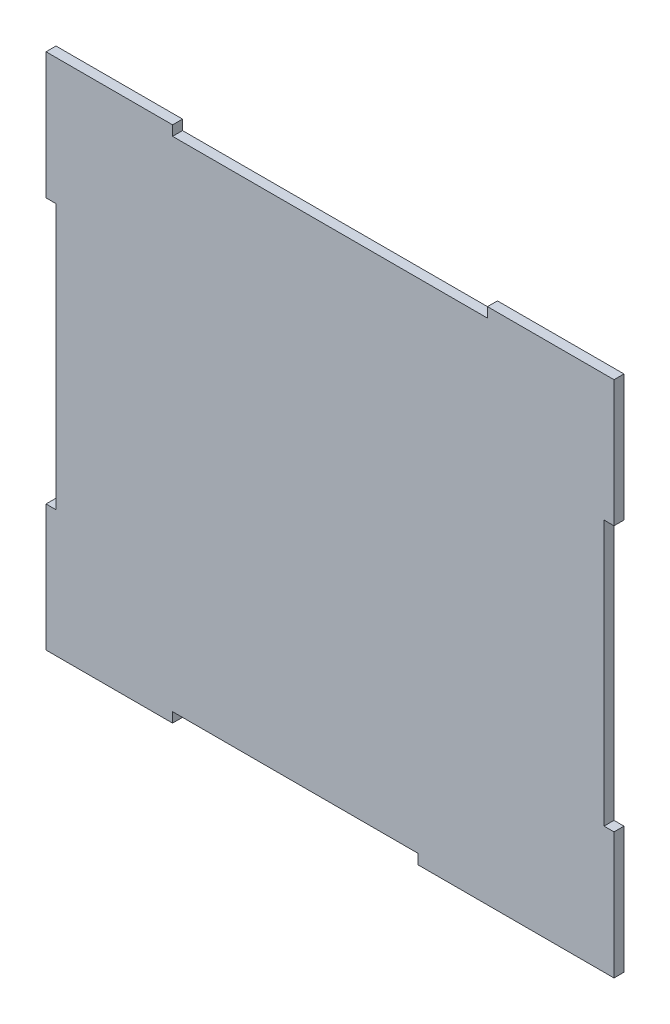
ISO-10303-21;
HEADER;
FILE_DESCRIPTION(('STEP AP214'),'2;1');
FILE_NAME('part.step','',(''),(''),'','','');
FILE_SCHEMA(('AUTOMOTIVE_DESIGN { 1 0 10303 214 1 1 1 1 }'));
ENDSEC;
DATA;
#1=APPLICATION_CONTEXT('core data for automotive mechanical design processes');
#2=APPLICATION_PROTOCOL_DEFINITION('international standard','automotive_design',2000,#1);
#3=PRODUCT_CONTEXT('',#1,'mechanical');
#4=PRODUCT('Part','Part','',(#3));
#5=PRODUCT_RELATED_PRODUCT_CATEGORY('part','',(#4));
#6=PRODUCT_DEFINITION_FORMATION('','',#4);
#7=PRODUCT_DEFINITION_CONTEXT('part definition',#1,'design');
#8=PRODUCT_DEFINITION('design','',#6,#7);
#9=PRODUCT_DEFINITION_SHAPE('','',#8);
#10=(LENGTH_UNIT() NAMED_UNIT(*) SI_UNIT(.MILLI.,.METRE.));
#11=(NAMED_UNIT(*) PLANE_ANGLE_UNIT() SI_UNIT($,.RADIAN.));
#12=(NAMED_UNIT(*) SI_UNIT($,.STERADIAN.) SOLID_ANGLE_UNIT());
#13=UNCERTAINTY_MEASURE_WITH_UNIT(LENGTH_MEASURE(1.E-05),#10,'distance_accuracy_value','');
#14=(GEOMETRIC_REPRESENTATION_CONTEXT(3) GLOBAL_UNCERTAINTY_ASSIGNED_CONTEXT((#13)) GLOBAL_UNIT_ASSIGNED_CONTEXT((#10,
#11,#12)) REPRESENTATION_CONTEXT('',''));
#15=CARTESIAN_POINT('',(0.,0.,0.));
#16=DIRECTION('',(0.,0.,1.));
#17=DIRECTION('',(1.,0.,0.));
#18=AXIS2_PLACEMENT_3D('',#15,#16,#17);
#19=CARTESIAN_POINT('',(-52.,26.6,2.));
#20=DIRECTION('',(1.,0.,0.));
#21=DIRECTION('',(0.,0.,-1.));
#22=AXIS2_PLACEMENT_3D('',#19,#20,#21);
#23=PLANE('',#22);
#24=DIRECTION('',(0.,-1.,0.));
#25=VECTOR('',#24,1.);
#26=CARTESIAN_POINT('',(-52.,26.6,0.));
#27=LINE('',#26,#25);
#28=CARTESIAN_POINT('',(-52.,52.,0.));
#29=VERTEX_POINT('',#28);
#30=CARTESIAN_POINT('',(-52.,26.6,0.));
#31=VERTEX_POINT('',#30);
#32=EDGE_CURVE('E205',#29,#31,#27,.T.);
#33=ORIENTED_EDGE('',*,*,#32,.T.);
#34=DIRECTION('',(0.,0.,-1.));
#35=VECTOR('',#34,1.);
#36=CARTESIAN_POINT('',(-52.,26.6,2.));
#37=LINE('',#36,#35);
#38=CARTESIAN_POINT('',(-52.,26.6,2.));
#39=VERTEX_POINT('',#38);
#40=EDGE_CURVE('E11',#39,#31,#37,.T.);
#41=ORIENTED_EDGE('',*,*,#40,.F.);
#42=DIRECTION('',(0.,-1.,0.));
#43=VECTOR('',#42,1.);
#44=CARTESIAN_POINT('',(-52.,26.6,2.));
#45=LINE('',#44,#43);
#46=CARTESIAN_POINT('',(-52.,52.,2.));
#47=VERTEX_POINT('',#46);
#48=EDGE_CURVE('E243',#47,#39,#45,.T.);
#49=ORIENTED_EDGE('',*,*,#48,.F.);
#50=DIRECTION('',(0.,0.,-1.));
#51=VECTOR('',#50,1.);
#52=CARTESIAN_POINT('',(-52.,52.,2.));
#53=LINE('',#52,#51);
#54=EDGE_CURVE('E201',#47,#29,#53,.T.);
#55=ORIENTED_EDGE('',*,*,#54,.T.);
#56=EDGE_LOOP('',(#33,#41,#49,#55));
#57=FACE_BOUND('',#56,.T.);
#58=ADVANCED_FACE('F37',(#57),#23,.F.);
#59=CARTESIAN_POINT('',(-52.,26.6,2.));
#60=DIRECTION('',(0.,1.,0.));
#61=DIRECTION('',(0.,0.,1.));
#62=AXIS2_PLACEMENT_3D('',#59,#60,#61);
#63=PLANE('',#62);
#64=DIRECTION('',(1.,0.,0.));
#65=VECTOR('',#64,1.);
#66=CARTESIAN_POINT('',(-52.,26.6,0.));
#67=LINE('',#66,#65);
#68=CARTESIAN_POINT('',(-50.,26.6,0.));
#69=VERTEX_POINT('',#68);
#70=EDGE_CURVE('E208',#31,#69,#67,.T.);
#71=ORIENTED_EDGE('',*,*,#70,.T.);
#72=DIRECTION('',(0.,0.,-1.));
#73=VECTOR('',#72,1.);
#74=CARTESIAN_POINT('',(-50.,26.6,2.));
#75=LINE('',#74,#73);
#76=CARTESIAN_POINT('',(-50.,26.6,2.));
#77=VERTEX_POINT('',#76);
#78=EDGE_CURVE('E45',#77,#69,#75,.T.);
#79=ORIENTED_EDGE('',*,*,#78,.F.);
#80=DIRECTION('',(1.,0.,0.));
#81=VECTOR('',#80,1.);
#82=CARTESIAN_POINT('',(-52.,26.6,2.));
#83=LINE('',#82,#81);
#84=EDGE_CURVE('E132',#39,#77,#83,.T.);
#85=ORIENTED_EDGE('',*,*,#84,.F.);
#86=ORIENTED_EDGE('',*,*,#40,.T.);
#87=EDGE_LOOP('',(#71,#79,#85,#86));
#88=FACE_BOUND('',#87,.T.);
#89=ADVANCED_FACE('F361',(#88),#63,.F.);
#90=CARTESIAN_POINT('',(-50.,-26.6,2.));
#91=DIRECTION('',(1.,0.,0.));
#92=DIRECTION('',(0.,0.,-1.));
#93=AXIS2_PLACEMENT_3D('',#90,#91,#92);
#94=PLANE('',#93);
#95=DIRECTION('',(0.,-1.,0.));
#96=VECTOR('',#95,1.);
#97=CARTESIAN_POINT('',(-50.,-26.6,0.));
#98=LINE('',#97,#96);
#99=CARTESIAN_POINT('',(-50.,-26.6,0.));
#100=VERTEX_POINT('',#99);
#101=EDGE_CURVE('E210',#69,#100,#98,.T.);
#102=ORIENTED_EDGE('',*,*,#101,.T.);
#103=DIRECTION('',(0.,0.,-1.));
#104=VECTOR('',#103,1.);
#105=CARTESIAN_POINT('',(-50.,-26.6,2.));
#106=LINE('',#105,#104);
#107=CARTESIAN_POINT('',(-50.,-26.6,2.));
#108=VERTEX_POINT('',#107);
#109=EDGE_CURVE('E286',#108,#100,#106,.T.);
#110=ORIENTED_EDGE('',*,*,#109,.F.);
#111=DIRECTION('',(0.,-1.,0.));
#112=VECTOR('',#111,1.);
#113=CARTESIAN_POINT('',(-50.,-26.6,2.));
#114=LINE('',#113,#112);
#115=EDGE_CURVE('E294',#77,#108,#114,.T.);
#116=ORIENTED_EDGE('',*,*,#115,.F.);
#117=ORIENTED_EDGE('',*,*,#78,.T.);
#118=EDGE_LOOP('',(#102,#110,#116,#117));
#119=FACE_BOUND('',#118,.T.);
#120=ADVANCED_FACE('F292',(#119),#94,.F.);
#121=CARTESIAN_POINT('',(-52.,-26.6,2.));
#122=DIRECTION('',(0.,-1.,0.));
#123=DIRECTION('',(0.,0.,-1.));
#124=AXIS2_PLACEMENT_3D('',#121,#122,#123);
#125=PLANE('',#124);
#126=DIRECTION('',(-1.,0.,0.));
#127=VECTOR('',#126,1.);
#128=CARTESIAN_POINT('',(-52.,-26.6,0.));
#129=LINE('',#128,#127);
#130=CARTESIAN_POINT('',(-52.,-26.6,0.));
#131=VERTEX_POINT('',#130);
#132=EDGE_CURVE('E212',#100,#131,#129,.T.);
#133=ORIENTED_EDGE('',*,*,#132,.T.);
#134=DIRECTION('',(0.,0.,-1.));
#135=VECTOR('',#134,1.);
#136=CARTESIAN_POINT('',(-52.,-26.6,2.));
#137=LINE('',#136,#135);
#138=CARTESIAN_POINT('',(-52.,-26.6,2.));
#139=VERTEX_POINT('',#138);
#140=EDGE_CURVE('E283',#139,#131,#137,.T.);
#141=ORIENTED_EDGE('',*,*,#140,.F.);
#142=DIRECTION('',(-1.,0.,0.));
#143=VECTOR('',#142,1.);
#144=CARTESIAN_POINT('',(-52.,-26.6,2.));
#145=LINE('',#144,#143);
#146=EDGE_CURVE('E312',#108,#139,#145,.T.);
#147=ORIENTED_EDGE('',*,*,#146,.F.);
#148=ORIENTED_EDGE('',*,*,#109,.T.);
#149=EDGE_LOOP('',(#133,#141,#147,#148));
#150=FACE_BOUND('',#149,.T.);
#151=ADVANCED_FACE('F303',(#150),#125,.F.);
#152=CARTESIAN_POINT('',(-52.,-52.,2.));
#153=DIRECTION('',(1.,0.,0.));
#154=DIRECTION('',(0.,0.,-1.));
#155=AXIS2_PLACEMENT_3D('',#152,#153,#154);
#156=PLANE('',#155);
#157=DIRECTION('',(0.,-1.,0.));
#158=VECTOR('',#157,1.);
#159=CARTESIAN_POINT('',(-52.,-52.,0.));
#160=LINE('',#159,#158);
#161=CARTESIAN_POINT('',(-52.,-52.,0.));
#162=VERTEX_POINT('',#161);
#163=EDGE_CURVE('E214',#131,#162,#160,.T.);
#164=ORIENTED_EDGE('',*,*,#163,.T.);
#165=DIRECTION('',(0.,0.,-1.));
#166=VECTOR('',#165,1.);
#167=CARTESIAN_POINT('',(-52.,-52.,2.));
#168=LINE('',#167,#166);
#169=CARTESIAN_POINT('',(-52.,-52.,2.));
#170=VERTEX_POINT('',#169);
#171=EDGE_CURVE('E280',#170,#162,#168,.T.);
#172=ORIENTED_EDGE('',*,*,#171,.F.);
#173=DIRECTION('',(0.,-1.,0.));
#174=VECTOR('',#173,1.);
#175=CARTESIAN_POINT('',(-52.,-52.,2.));
#176=LINE('',#175,#174);
#177=EDGE_CURVE('E309',#139,#170,#176,.T.);
#178=ORIENTED_EDGE('',*,*,#177,.F.);
#179=ORIENTED_EDGE('',*,*,#140,.T.);
#180=EDGE_LOOP('',(#164,#172,#178,#179));
#181=FACE_BOUND('',#180,.T.);
#182=ADVANCED_FACE('F307',(#181),#156,.F.);
#183=CARTESIAN_POINT('',(-52.,-52.,2.));
#184=DIRECTION('',(0.,1.,0.));
#185=DIRECTION('',(0.,0.,1.));
#186=AXIS2_PLACEMENT_3D('',#183,#184,#185);
#187=PLANE('',#186);
#188=DIRECTION('',(1.,0.,0.));
#189=VECTOR('',#188,1.);
#190=CARTESIAN_POINT('',(-52.,-52.,0.));
#191=LINE('',#190,#189);
#192=CARTESIAN_POINT('',(-26.6,-52.,0.));
#193=VERTEX_POINT('',#192);
#194=EDGE_CURVE('E216',#162,#193,#191,.T.);
#195=ORIENTED_EDGE('',*,*,#194,.T.);
#196=DIRECTION('',(0.,0.,-1.));
#197=VECTOR('',#196,1.);
#198=CARTESIAN_POINT('',(-26.6,-52.,2.));
#199=LINE('',#198,#197);
#200=CARTESIAN_POINT('',(-26.6,-52.,2.));
#201=VERTEX_POINT('',#200);
#202=EDGE_CURVE('E277',#201,#193,#199,.T.);
#203=ORIENTED_EDGE('',*,*,#202,.F.);
#204=DIRECTION('',(1.,0.,0.));
#205=VECTOR('',#204,1.);
#206=CARTESIAN_POINT('',(-52.,-52.,2.));
#207=LINE('',#206,#205);
#208=EDGE_CURVE('E311',#170,#201,#207,.T.);
#209=ORIENTED_EDGE('',*,*,#208,.F.);
#210=ORIENTED_EDGE('',*,*,#171,.T.);
#211=EDGE_LOOP('',(#195,#203,#209,#210));
#212=FACE_BOUND('',#211,.T.);
#213=ADVANCED_FACE('F374',(#212),#187,.F.);
#214=CARTESIAN_POINT('',(-26.6,-50.,2.));
#215=DIRECTION('',(-1.,0.,0.));
#216=DIRECTION('',(0.,0.,1.));
#217=AXIS2_PLACEMENT_3D('',#214,#215,#216);
#218=PLANE('',#217);
#219=DIRECTION('',(0.,1.,0.));
#220=VECTOR('',#219,1.);
#221=CARTESIAN_POINT('',(-26.6,-50.,0.));
#222=LINE('',#221,#220);
#223=CARTESIAN_POINT('',(-26.6,-50.,0.));
#224=VERTEX_POINT('',#223);
#225=EDGE_CURVE('E218',#193,#224,#222,.T.);
#226=ORIENTED_EDGE('',*,*,#225,.T.);
#227=DIRECTION('',(0.,0.,-1.));
#228=VECTOR('',#227,1.);
#229=CARTESIAN_POINT('',(-26.6,-50.,2.));
#230=LINE('',#229,#228);
#231=CARTESIAN_POINT('',(-26.6,-50.,2.));
#232=VERTEX_POINT('',#231);
#233=EDGE_CURVE('E274',#232,#224,#230,.T.);
#234=ORIENTED_EDGE('',*,*,#233,.F.);
#235=DIRECTION('',(0.,1.,0.));
#236=VECTOR('',#235,1.);
#237=CARTESIAN_POINT('',(-26.6,-50.,2.));
#238=LINE('',#237,#236);
#239=EDGE_CURVE('E314',#201,#232,#238,.T.);
#240=ORIENTED_EDGE('',*,*,#239,.F.);
#241=ORIENTED_EDGE('',*,*,#202,.T.);
#242=EDGE_LOOP('',(#226,#234,#240,#241));
#243=FACE_BOUND('',#242,.T.);
#244=ADVANCED_FACE('F377',(#243),#218,.F.);
#245=CARTESIAN_POINT('',(-26.6,-50.,2.));
#246=DIRECTION('',(0.,1.,0.));
#247=DIRECTION('',(0.,0.,1.));
#248=AXIS2_PLACEMENT_3D('',#245,#246,#247);
#249=PLANE('',#248);
#250=DIRECTION('',(1.,0.,0.));
#251=VECTOR('',#250,1.);
#252=CARTESIAN_POINT('',(-26.6,-50.,0.));
#253=LINE('',#252,#251);
#254=CARTESIAN_POINT('',(22.63,-50.,0.));
#255=VERTEX_POINT('',#254);
#256=EDGE_CURVE('E220',#224,#255,#253,.T.);
#257=ORIENTED_EDGE('',*,*,#256,.T.);
#258=DIRECTION('',(0.,0.,-1.));
#259=VECTOR('',#258,1.);
#260=CARTESIAN_POINT('',(22.63,-50.,2.));
#261=LINE('',#260,#259);
#262=CARTESIAN_POINT('',(22.63,-50.,2.));
#263=VERTEX_POINT('',#262);
#264=EDGE_CURVE('E271',#263,#255,#261,.T.);
#265=ORIENTED_EDGE('',*,*,#264,.F.);
#266=DIRECTION('',(1.,0.,0.));
#267=VECTOR('',#266,1.);
#268=CARTESIAN_POINT('',(-26.6,-50.,2.));
#269=LINE('',#268,#267);
#270=EDGE_CURVE('E320',#232,#263,#269,.T.);
#271=ORIENTED_EDGE('',*,*,#270,.F.);
#272=ORIENTED_EDGE('',*,*,#233,.T.);
#273=EDGE_LOOP('',(#257,#265,#271,#272));
#274=FACE_BOUND('',#273,.T.);
#275=ADVANCED_FACE('F381',(#274),#249,.F.);
#276=CARTESIAN_POINT('',(22.63,-52.,2.));
#277=DIRECTION('',(1.,0.,0.));
#278=DIRECTION('',(0.,0.,-1.));
#279=AXIS2_PLACEMENT_3D('',#276,#277,#278);
#280=PLANE('',#279);
#281=DIRECTION('',(0.,-1.,0.));
#282=VECTOR('',#281,1.);
#283=CARTESIAN_POINT('',(22.63,-52.,0.));
#284=LINE('',#283,#282);
#285=CARTESIAN_POINT('',(22.63,-52.,0.));
#286=VERTEX_POINT('',#285);
#287=EDGE_CURVE('E222',#255,#286,#284,.T.);
#288=ORIENTED_EDGE('',*,*,#287,.T.);
#289=DIRECTION('',(0.,0.,-1.));
#290=VECTOR('',#289,1.);
#291=CARTESIAN_POINT('',(22.63,-52.,2.));
#292=LINE('',#291,#290);
#293=CARTESIAN_POINT('',(22.63,-52.,2.));
#294=VERTEX_POINT('',#293);
#295=EDGE_CURVE('E268',#294,#286,#292,.T.);
#296=ORIENTED_EDGE('',*,*,#295,.F.);
#297=DIRECTION('',(0.,-1.,0.));
#298=VECTOR('',#297,1.);
#299=CARTESIAN_POINT('',(22.63,-52.,2.));
#300=LINE('',#299,#298);
#301=EDGE_CURVE('E322',#263,#294,#300,.T.);
#302=ORIENTED_EDGE('',*,*,#301,.F.);
#303=ORIENTED_EDGE('',*,*,#264,.T.);
#304=EDGE_LOOP('',(#288,#296,#302,#303));
#305=FACE_BOUND('',#304,.T.);
#306=ADVANCED_FACE('F385',(#305),#280,.F.);
#307=CARTESIAN_POINT('',(22.63,-52.,2.));
#308=DIRECTION('',(0.,1.,0.));
#309=DIRECTION('',(0.,0.,1.));
#310=AXIS2_PLACEMENT_3D('',#307,#308,#309);
#311=PLANE('',#310);
#312=DIRECTION('',(1.,0.,0.));
#313=VECTOR('',#312,1.);
#314=CARTESIAN_POINT('',(22.63,-52.,0.));
#315=LINE('',#314,#313);
#316=CARTESIAN_POINT('',(62.,-52.,0.));
#317=VERTEX_POINT('',#316);
#318=EDGE_CURVE('E224',#286,#317,#315,.T.);
#319=ORIENTED_EDGE('',*,*,#318,.T.);
#320=DIRECTION('',(0.,0.,-1.));
#321=VECTOR('',#320,1.);
#322=CARTESIAN_POINT('',(62.,-52.,2.));
#323=LINE('',#322,#321);
#324=CARTESIAN_POINT('',(62.,-52.,2.));
#325=VERTEX_POINT('',#324);
#326=EDGE_CURVE('E265',#325,#317,#323,.T.);
#327=ORIENTED_EDGE('',*,*,#326,.F.);
#328=DIRECTION('',(1.,0.,0.));
#329=VECTOR('',#328,1.);
#330=CARTESIAN_POINT('',(22.63,-52.,2.));
#331=LINE('',#330,#329);
#332=EDGE_CURVE('E324',#294,#325,#331,.T.);
#333=ORIENTED_EDGE('',*,*,#332,.F.);
#334=ORIENTED_EDGE('',*,*,#295,.T.);
#335=EDGE_LOOP('',(#319,#327,#333,#334));
#336=FACE_BOUND('',#335,.T.);
#337=ADVANCED_FACE('F389',(#336),#311,.F.);
#338=CARTESIAN_POINT('',(62.,-52.,2.));
#339=DIRECTION('',(-1.,0.,0.));
#340=DIRECTION('',(0.,-1.,0.));
#341=AXIS2_PLACEMENT_3D('',#338,#339,#340);
#342=PLANE('',#341);
#343=DIRECTION('',(0.,1.,0.));
#344=VECTOR('',#343,1.);
#345=CARTESIAN_POINT('',(62.,-52.,0.));
#346=LINE('',#345,#344);
#347=CARTESIAN_POINT('',(62.,-26.6,0.));
#348=VERTEX_POINT('',#347);
#349=EDGE_CURVE('E226',#317,#348,#346,.T.);
#350=ORIENTED_EDGE('',*,*,#349,.T.);
#351=DIRECTION('',(0.,0.,-1.));
#352=VECTOR('',#351,1.);
#353=CARTESIAN_POINT('',(62.,-26.6,2.));
#354=LINE('',#353,#352);
#355=CARTESIAN_POINT('',(62.,-26.6,2.));
#356=VERTEX_POINT('',#355);
#357=EDGE_CURVE('E262',#356,#348,#354,.T.);
#358=ORIENTED_EDGE('',*,*,#357,.F.);
#359=DIRECTION('',(0.,1.,0.));
#360=VECTOR('',#359,1.);
#361=CARTESIAN_POINT('',(62.,-52.,2.));
#362=LINE('',#361,#360);
#363=EDGE_CURVE('E326',#325,#356,#362,.T.);
#364=ORIENTED_EDGE('',*,*,#363,.F.);
#365=ORIENTED_EDGE('',*,*,#326,.T.);
#366=EDGE_LOOP('',(#350,#358,#364,#365));
#367=FACE_BOUND('',#366,.T.);
#368=ADVANCED_FACE('F393',(#367),#342,.F.);
#369=CARTESIAN_POINT('',(60.,-26.6,2.));
#370=DIRECTION('',(0.,-1.,0.));
#371=DIRECTION('',(0.,0.,-1.));
#372=AXIS2_PLACEMENT_3D('',#369,#370,#371);
#373=PLANE('',#372);
#374=DIRECTION('',(-1.,0.,0.));
#375=VECTOR('',#374,1.);
#376=CARTESIAN_POINT('',(60.,-26.6,0.));
#377=LINE('',#376,#375);
#378=CARTESIAN_POINT('',(60.,-26.6,0.));
#379=VERTEX_POINT('',#378);
#380=EDGE_CURVE('E228',#348,#379,#377,.T.);
#381=ORIENTED_EDGE('',*,*,#380,.T.);
#382=DIRECTION('',(0.,0.,-1.));
#383=VECTOR('',#382,1.);
#384=CARTESIAN_POINT('',(60.,-26.6,2.));
#385=LINE('',#384,#383);
#386=CARTESIAN_POINT('',(60.,-26.6,2.));
#387=VERTEX_POINT('',#386);
#388=EDGE_CURVE('E259',#387,#379,#385,.T.);
#389=ORIENTED_EDGE('',*,*,#388,.F.);
#390=DIRECTION('',(-1.,0.,0.));
#391=VECTOR('',#390,1.);
#392=CARTESIAN_POINT('',(60.,-26.6,2.));
#393=LINE('',#392,#391);
#394=EDGE_CURVE('E328',#356,#387,#393,.T.);
#395=ORIENTED_EDGE('',*,*,#394,.F.);
#396=ORIENTED_EDGE('',*,*,#357,.T.);
#397=EDGE_LOOP('',(#381,#389,#395,#396));
#398=FACE_BOUND('',#397,.T.);
#399=ADVANCED_FACE('F397',(#398),#373,.F.);
#400=CARTESIAN_POINT('',(60.,-26.6,2.));
#401=DIRECTION('',(-1.,0.,0.));
#402=DIRECTION('',(0.,0.,1.));
#403=AXIS2_PLACEMENT_3D('',#400,#401,#402);
#404=PLANE('',#403);
#405=DIRECTION('',(0.,1.,0.));
#406=VECTOR('',#405,1.);
#407=CARTESIAN_POINT('',(60.,-26.6,0.));
#408=LINE('',#407,#406);
#409=CARTESIAN_POINT('',(60.,26.6,0.));
#410=VERTEX_POINT('',#409);
#411=EDGE_CURVE('E230',#379,#410,#408,.T.);
#412=ORIENTED_EDGE('',*,*,#411,.T.);
#413=DIRECTION('',(0.,0.,-1.));
#414=VECTOR('',#413,1.);
#415=CARTESIAN_POINT('',(60.,26.6,2.));
#416=LINE('',#415,#414);
#417=CARTESIAN_POINT('',(60.,26.6,2.));
#418=VERTEX_POINT('',#417);
#419=EDGE_CURVE('E256',#418,#410,#416,.T.);
#420=ORIENTED_EDGE('',*,*,#419,.F.);
#421=DIRECTION('',(0.,1.,0.));
#422=VECTOR('',#421,1.);
#423=CARTESIAN_POINT('',(60.,-26.6,2.));
#424=LINE('',#423,#422);
#425=EDGE_CURVE('E330',#387,#418,#424,.T.);
#426=ORIENTED_EDGE('',*,*,#425,.F.);
#427=ORIENTED_EDGE('',*,*,#388,.T.);
#428=EDGE_LOOP('',(#412,#420,#426,#427));
#429=FACE_BOUND('',#428,.T.);
#430=ADVANCED_FACE('F401',(#429),#404,.F.);
#431=CARTESIAN_POINT('',(60.,26.6,2.));
#432=DIRECTION('',(0.,1.,0.));
#433=DIRECTION('',(0.,0.,1.));
#434=AXIS2_PLACEMENT_3D('',#431,#432,#433);
#435=PLANE('',#434);
#436=DIRECTION('',(1.,0.,0.));
#437=VECTOR('',#436,1.);
#438=CARTESIAN_POINT('',(60.,26.6,0.));
#439=LINE('',#438,#437);
#440=CARTESIAN_POINT('',(62.,26.6,0.));
#441=VERTEX_POINT('',#440);
#442=EDGE_CURVE('E232',#410,#441,#439,.T.);
#443=ORIENTED_EDGE('',*,*,#442,.T.);
#444=DIRECTION('',(0.,0.,-1.));
#445=VECTOR('',#444,1.);
#446=CARTESIAN_POINT('',(62.,26.6,2.));
#447=LINE('',#446,#445);
#448=CARTESIAN_POINT('',(62.,26.6,2.));
#449=VERTEX_POINT('',#448);
#450=EDGE_CURVE('E253',#449,#441,#447,.T.);
#451=ORIENTED_EDGE('',*,*,#450,.F.);
#452=DIRECTION('',(1.,0.,0.));
#453=VECTOR('',#452,1.);
#454=CARTESIAN_POINT('',(60.,26.6,2.));
#455=LINE('',#454,#453);
#456=EDGE_CURVE('E332',#418,#449,#455,.T.);
#457=ORIENTED_EDGE('',*,*,#456,.F.);
#458=ORIENTED_EDGE('',*,*,#419,.T.);
#459=EDGE_LOOP('',(#443,#451,#457,#458));
#460=FACE_BOUND('',#459,.T.);
#461=ADVANCED_FACE('F405',(#460),#435,.F.);
#462=CARTESIAN_POINT('',(62.,26.6,2.));
#463=DIRECTION('',(-1.,0.,0.));
#464=DIRECTION('',(0.,0.,1.));
#465=AXIS2_PLACEMENT_3D('',#462,#463,#464);
#466=PLANE('',#465);
#467=DIRECTION('',(0.,1.,0.));
#468=VECTOR('',#467,1.);
#469=CARTESIAN_POINT('',(62.,26.6,0.));
#470=LINE('',#469,#468);
#471=CARTESIAN_POINT('',(62.,52.,0.));
#472=VERTEX_POINT('',#471);
#473=EDGE_CURVE('E234',#441,#472,#470,.T.);
#474=ORIENTED_EDGE('',*,*,#473,.T.);
#475=DIRECTION('',(0.,0.,-1.));
#476=VECTOR('',#475,1.);
#477=CARTESIAN_POINT('',(62.,52.,2.));
#478=LINE('',#477,#476);
#479=CARTESIAN_POINT('',(62.,52.,2.));
#480=VERTEX_POINT('',#479);
#481=EDGE_CURVE('E250',#480,#472,#478,.T.);
#482=ORIENTED_EDGE('',*,*,#481,.F.);
#483=DIRECTION('',(0.,1.,0.));
#484=VECTOR('',#483,1.);
#485=CARTESIAN_POINT('',(62.,26.6,2.));
#486=LINE('',#485,#484);
#487=EDGE_CURVE('E334',#449,#480,#486,.T.);
#488=ORIENTED_EDGE('',*,*,#487,.F.);
#489=ORIENTED_EDGE('',*,*,#450,.T.);
#490=EDGE_LOOP('',(#474,#482,#488,#489));
#491=FACE_BOUND('',#490,.T.);
#492=ADVANCED_FACE('F409',(#491),#466,.F.);
#493=CARTESIAN_POINT('',(36.6,52.,2.));
#494=DIRECTION('',(0.,-1.,0.));
#495=DIRECTION('',(0.,0.,-1.));
#496=AXIS2_PLACEMENT_3D('',#493,#494,#495);
#497=PLANE('',#496);
#498=DIRECTION('',(-1.,0.,0.));
#499=VECTOR('',#498,1.);
#500=CARTESIAN_POINT('',(36.6,52.,0.));
#501=LINE('',#500,#499);
#502=CARTESIAN_POINT('',(36.6,52.,0.));
#503=VERTEX_POINT('',#502);
#504=EDGE_CURVE('E236',#472,#503,#501,.T.);
#505=ORIENTED_EDGE('',*,*,#504,.T.);
#506=DIRECTION('',(0.,0.,-1.));
#507=VECTOR('',#506,1.);
#508=CARTESIAN_POINT('',(36.6,52.,2.));
#509=LINE('',#508,#507);
#510=CARTESIAN_POINT('',(36.6,52.,2.));
#511=VERTEX_POINT('',#510);
#512=EDGE_CURVE('E247',#511,#503,#509,.T.);
#513=ORIENTED_EDGE('',*,*,#512,.F.);
#514=DIRECTION('',(-1.,0.,0.));
#515=VECTOR('',#514,1.);
#516=CARTESIAN_POINT('',(36.6,52.,2.));
#517=LINE('',#516,#515);
#518=EDGE_CURVE('E336',#480,#511,#517,.T.);
#519=ORIENTED_EDGE('',*,*,#518,.F.);
#520=ORIENTED_EDGE('',*,*,#481,.T.);
#521=EDGE_LOOP('',(#505,#513,#519,#520));
#522=FACE_BOUND('',#521,.T.);
#523=ADVANCED_FACE('F342',(#522),#497,.F.);
#524=CARTESIAN_POINT('',(36.6,52.,2.));
#525=DIRECTION('',(1.,0.,0.));
#526=DIRECTION('',(0.,1.,0.));
#527=AXIS2_PLACEMENT_3D('',#524,#525,#526);
#528=PLANE('',#527);
#529=DIRECTION('',(0.,-1.,0.));
#530=VECTOR('',#529,1.);
#531=CARTESIAN_POINT('',(36.6,52.,0.));
#532=LINE('',#531,#530);
#533=CARTESIAN_POINT('',(36.6,50.,0.));
#534=VERTEX_POINT('',#533);
#535=EDGE_CURVE('E238',#503,#534,#532,.T.);
#536=ORIENTED_EDGE('',*,*,#535,.T.);
#537=DIRECTION('',(0.,0.,-1.));
#538=VECTOR('',#537,1.);
#539=CARTESIAN_POINT('',(36.6,50.,2.));
#540=LINE('',#539,#538);
#541=CARTESIAN_POINT('',(36.6,50.,2.));
#542=VERTEX_POINT('',#541);
#543=EDGE_CURVE('E196',#542,#534,#540,.T.);
#544=ORIENTED_EDGE('',*,*,#543,.F.);
#545=DIRECTION('',(0.,-1.,0.));
#546=VECTOR('',#545,1.);
#547=CARTESIAN_POINT('',(36.6,52.,2.));
#548=LINE('',#547,#546);
#549=EDGE_CURVE('E187',#511,#542,#548,.T.);
#550=ORIENTED_EDGE('',*,*,#549,.F.);
#551=ORIENTED_EDGE('',*,*,#512,.T.);
#552=EDGE_LOOP('',(#536,#544,#550,#551));
#553=FACE_BOUND('',#552,.T.);
#554=ADVANCED_FACE('F346',(#553),#528,.F.);
#555=CARTESIAN_POINT('',(-26.6,50.,2.));
#556=DIRECTION('',(0.,-1.,0.));
#557=DIRECTION('',(0.,0.,-1.));
#558=AXIS2_PLACEMENT_3D('',#555,#556,#557);
#559=PLANE('',#558);
#560=DIRECTION('',(-1.,0.,0.));
#561=VECTOR('',#560,1.);
#562=CARTESIAN_POINT('',(-26.6,50.,0.));
#563=LINE('',#562,#561);
#564=CARTESIAN_POINT('',(-26.6,50.,0.));
#565=VERTEX_POINT('',#564);
#566=EDGE_CURVE('E195',#534,#565,#563,.T.);
#567=ORIENTED_EDGE('',*,*,#566,.T.);
#568=DIRECTION('',(0.,0.,-1.));
#569=VECTOR('',#568,1.);
#570=CARTESIAN_POINT('',(-26.6,50.,2.));
#571=LINE('',#570,#569);
#572=CARTESIAN_POINT('',(-26.6,50.,2.));
#573=VERTEX_POINT('',#572);
#574=EDGE_CURVE('E192',#573,#565,#571,.T.);
#575=ORIENTED_EDGE('',*,*,#574,.F.);
#576=DIRECTION('',(-1.,0.,0.));
#577=VECTOR('',#576,1.);
#578=CARTESIAN_POINT('',(-26.6,50.,2.));
#579=LINE('',#578,#577);
#580=EDGE_CURVE('E181',#542,#573,#579,.T.);
#581=ORIENTED_EDGE('',*,*,#580,.F.);
#582=ORIENTED_EDGE('',*,*,#543,.T.);
#583=EDGE_LOOP('',(#567,#575,#581,#582));
#584=FACE_BOUND('',#583,.T.);
#585=ADVANCED_FACE('F193',(#584),#559,.F.);
#586=CARTESIAN_POINT('',(-26.6,50.,2.));
#587=DIRECTION('',(-1.,0.,0.));
#588=DIRECTION('',(0.,0.,1.));
#589=AXIS2_PLACEMENT_3D('',#586,#587,#588);
#590=PLANE('',#589);
#591=DIRECTION('',(0.,1.,0.));
#592=VECTOR('',#591,1.);
#593=CARTESIAN_POINT('',(-26.6,50.,0.));
#594=LINE('',#593,#592);
#595=CARTESIAN_POINT('',(-26.6,52.,0.));
#596=VERTEX_POINT('',#595);
#597=EDGE_CURVE('E118',#565,#596,#594,.T.);
#598=ORIENTED_EDGE('',*,*,#597,.T.);
#599=DIRECTION('',(0.,0.,-1.));
#600=VECTOR('',#599,1.);
#601=CARTESIAN_POINT('',(-26.6,52.,2.));
#602=LINE('',#601,#600);
#603=CARTESIAN_POINT('',(-26.6,52.,2.));
#604=VERTEX_POINT('',#603);
#605=EDGE_CURVE('E197',#604,#596,#602,.T.);
#606=ORIENTED_EDGE('',*,*,#605,.F.);
#607=DIRECTION('',(0.,1.,0.));
#608=VECTOR('',#607,1.);
#609=CARTESIAN_POINT('',(-26.6,50.,2.));
#610=LINE('',#609,#608);
#611=EDGE_CURVE('E185',#573,#604,#610,.T.);
#612=ORIENTED_EDGE('',*,*,#611,.F.);
#613=ORIENTED_EDGE('',*,*,#574,.T.);
#614=EDGE_LOOP('',(#598,#606,#612,#613));
#615=FACE_BOUND('',#614,.T.);
#616=ADVANCED_FACE('F199',(#615),#590,.F.);
#617=CARTESIAN_POINT('',(-52.,52.,2.));
#618=DIRECTION('',(0.,-1.,0.));
#619=DIRECTION('',(0.,0.,-1.));
#620=AXIS2_PLACEMENT_3D('',#617,#618,#619);
#621=PLANE('',#620);
#622=DIRECTION('',(-1.,0.,0.));
#623=VECTOR('',#622,1.);
#624=CARTESIAN_POINT('',(-52.,52.,0.));
#625=LINE('',#624,#623);
#626=EDGE_CURVE('E124',#596,#29,#625,.T.);
#627=ORIENTED_EDGE('',*,*,#626,.T.);
#628=ORIENTED_EDGE('',*,*,#54,.F.);
#629=DIRECTION('',(-1.,0.,0.));
#630=VECTOR('',#629,1.);
#631=CARTESIAN_POINT('',(-52.,52.,2.));
#632=LINE('',#631,#630);
#633=EDGE_CURVE('E53',#604,#47,#632,.T.);
#634=ORIENTED_EDGE('',*,*,#633,.F.);
#635=ORIENTED_EDGE('',*,*,#605,.T.);
#636=EDGE_LOOP('',(#627,#628,#634,#635));
#637=FACE_BOUND('',#636,.T.);
#638=ADVANCED_FACE('F350',(#637),#621,.F.);
#639=CARTESIAN_POINT('',(0.,0.,2.));
#640=DIRECTION('',(0.,0.,-1.));
#641=DIRECTION('',(-1.,0.,0.));
#642=AXIS2_PLACEMENT_3D('',#639,#640,#641);
#643=PLANE('',#642);
#644=ORIENTED_EDGE('',*,*,#48,.T.);
#645=ORIENTED_EDGE('',*,*,#84,.T.);
#646=ORIENTED_EDGE('',*,*,#115,.T.);
#647=ORIENTED_EDGE('',*,*,#146,.T.);
#648=ORIENTED_EDGE('',*,*,#177,.T.);
#649=ORIENTED_EDGE('',*,*,#208,.T.);
#650=ORIENTED_EDGE('',*,*,#239,.T.);
#651=ORIENTED_EDGE('',*,*,#270,.T.);
#652=ORIENTED_EDGE('',*,*,#301,.T.);
#653=ORIENTED_EDGE('',*,*,#332,.T.);
#654=ORIENTED_EDGE('',*,*,#363,.T.);
#655=ORIENTED_EDGE('',*,*,#394,.T.);
#656=ORIENTED_EDGE('',*,*,#425,.T.);
#657=ORIENTED_EDGE('',*,*,#456,.T.);
#658=ORIENTED_EDGE('',*,*,#487,.T.);
#659=ORIENTED_EDGE('',*,*,#518,.T.);
#660=ORIENTED_EDGE('',*,*,#549,.T.);
#661=ORIENTED_EDGE('',*,*,#580,.T.);
#662=ORIENTED_EDGE('',*,*,#611,.T.);
#663=ORIENTED_EDGE('',*,*,#633,.T.);
#664=EDGE_LOOP('',(#644,#645,#646,#647,#648,#649,#650,#651,#652,#653,#654,#655,#656,#657,#658,
#659,#660,#661,#662,#663));
#665=FACE_BOUND('',#664,.T.);
#666=ADVANCED_FACE('F183',(#665),#643,.F.);
#667=CARTESIAN_POINT('',(0.,0.,0.));
#668=DIRECTION('',(0.,0.,-1.));
#669=DIRECTION('',(-1.,0.,0.));
#670=AXIS2_PLACEMENT_3D('',#667,#668,#669);
#671=PLANE('',#670);
#672=ORIENTED_EDGE('',*,*,#32,.F.);
#673=ORIENTED_EDGE('',*,*,#626,.F.);
#674=ORIENTED_EDGE('',*,*,#597,.F.);
#675=ORIENTED_EDGE('',*,*,#566,.F.);
#676=ORIENTED_EDGE('',*,*,#535,.F.);
#677=ORIENTED_EDGE('',*,*,#504,.F.);
#678=ORIENTED_EDGE('',*,*,#473,.F.);
#679=ORIENTED_EDGE('',*,*,#442,.F.);
#680=ORIENTED_EDGE('',*,*,#411,.F.);
#681=ORIENTED_EDGE('',*,*,#380,.F.);
#682=ORIENTED_EDGE('',*,*,#349,.F.);
#683=ORIENTED_EDGE('',*,*,#318,.F.);
#684=ORIENTED_EDGE('',*,*,#287,.F.);
#685=ORIENTED_EDGE('',*,*,#256,.F.);
#686=ORIENTED_EDGE('',*,*,#225,.F.);
#687=ORIENTED_EDGE('',*,*,#194,.F.);
#688=ORIENTED_EDGE('',*,*,#163,.F.);
#689=ORIENTED_EDGE('',*,*,#132,.F.);
#690=ORIENTED_EDGE('',*,*,#101,.F.);
#691=ORIENTED_EDGE('',*,*,#70,.F.);
#692=EDGE_LOOP('',(#672,#673,#674,#675,#676,#677,#678,#679,#680,#681,#682,#683,#684,#685,#686,
#687,#688,#689,#690,#691));
#693=FACE_BOUND('',#692,.T.);
#694=ADVANCED_FACE('F298',(#693),#671,.T.);
#695=CLOSED_SHELL('',(#58,#89,#120,#151,#182,#213,#244,#275,#306,#337,#368,#399,#430,#461,#492,
#523,#554,#585,#616,#638,#666,#694));
#696=MANIFOLD_SOLID_BREP('B2',#695);
#697=ADVANCED_BREP_SHAPE_REPRESENTATION('',(#18,#696),#14);
#698=SHAPE_DEFINITION_REPRESENTATION(#9,#697);
ENDSEC;
END-ISO-10303-21;
